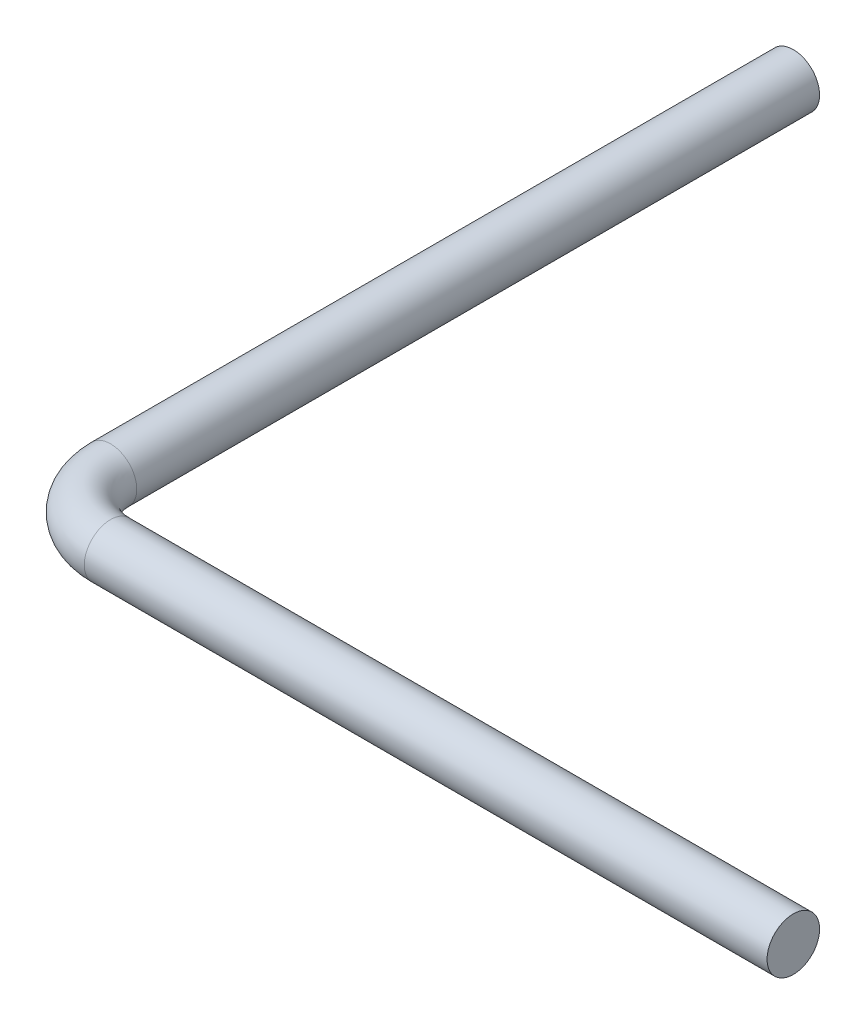
ISO-10303-21;
HEADER;
FILE_DESCRIPTION(('STEP AP214'),'2;1');
FILE_NAME('part.step','',(''),(''),'','','');
FILE_SCHEMA(('AUTOMOTIVE_DESIGN { 1 0 10303 214 1 1 1 1 }'));
ENDSEC;
DATA;
#1=APPLICATION_CONTEXT('core data for automotive mechanical design processes');
#2=APPLICATION_PROTOCOL_DEFINITION('international standard','automotive_design',2000,#1);
#3=PRODUCT_CONTEXT('',#1,'mechanical');
#4=PRODUCT('Part','Part','',(#3));
#5=PRODUCT_RELATED_PRODUCT_CATEGORY('part','',(#4));
#6=PRODUCT_DEFINITION_FORMATION('','',#4);
#7=PRODUCT_DEFINITION_CONTEXT('part definition',#1,'design');
#8=PRODUCT_DEFINITION('design','',#6,#7);
#9=PRODUCT_DEFINITION_SHAPE('','',#8);
#10=(LENGTH_UNIT() NAMED_UNIT(*) SI_UNIT(.MILLI.,.METRE.));
#11=(NAMED_UNIT(*) PLANE_ANGLE_UNIT() SI_UNIT($,.RADIAN.));
#12=(NAMED_UNIT(*) SI_UNIT($,.STERADIAN.) SOLID_ANGLE_UNIT());
#13=UNCERTAINTY_MEASURE_WITH_UNIT(LENGTH_MEASURE(1.E-05),#10,'distance_accuracy_value','');
#14=(GEOMETRIC_REPRESENTATION_CONTEXT(3) GLOBAL_UNCERTAINTY_ASSIGNED_CONTEXT((#13)) GLOBAL_UNIT_ASSIGNED_CONTEXT((#10,
#11,#12)) REPRESENTATION_CONTEXT('',''));
#15=CARTESIAN_POINT('',(0.,0.,0.));
#16=DIRECTION('',(0.,0.,1.));
#17=DIRECTION('',(1.,0.,0.));
#18=AXIS2_PLACEMENT_3D('',#15,#16,#17);
#19=CARTESIAN_POINT('',(0.,0.,50.));
#20=DIRECTION('',(0.,0.,-1.));
#21=DIRECTION('',(-1.,0.,0.));
#22=AXIS2_PLACEMENT_3D('',#19,#20,#21);
#23=CYLINDRICAL_SURFACE('',#22,2.);
#24=CARTESIAN_POINT('',(0.,0.,0.));
#25=DIRECTION('',(0.,0.,1.));
#26=DIRECTION('',(1.,0.,0.));
#27=AXIS2_PLACEMENT_3D('',#24,#25,#26);
#28=CIRCLE('',#27,2.);
#29=CARTESIAN_POINT('',(2.,0.,0.));
#30=VERTEX_POINT('',#29);
#31=EDGE_CURVE('E10',#30,#30,#28,.T.);
#32=ORIENTED_EDGE('',*,*,#31,.T.);
#33=EDGE_LOOP('',(#32));
#34=FACE_BOUND('',#33,.T.);
#35=CARTESIAN_POINT('',(0.,0.,52.));
#36=DIRECTION('',(0.,0.,1.));
#37=DIRECTION('',(1.,0.,0.));
#38=AXIS2_PLACEMENT_3D('',#35,#36,#37);
#39=CIRCLE('',#38,2.);
#40=CARTESIAN_POINT('',(-1.99999999999979,0.,52.));
#41=VERTEX_POINT('',#40);
#42=EDGE_CURVE('E48',#41,#41,#39,.T.);
#43=ORIENTED_EDGE('',*,*,#42,.F.);
#44=EDGE_LOOP('',(#43));
#45=FACE_BOUND('',#44,.T.);
#46=ADVANCED_FACE('F34',(#34,#45),#23,.T.);
#47=CARTESIAN_POINT('',(0.,0.,0.));
#48=DIRECTION('',(0.,0.,1.));
#49=DIRECTION('',(1.,0.,0.));
#50=AXIS2_PLACEMENT_3D('',#47,#48,#49);
#51=PLANE('',#50);
#52=ORIENTED_EDGE('',*,*,#31,.F.);
#53=EDGE_LOOP('',(#52));
#54=FACE_BOUND('',#53,.T.);
#55=ADVANCED_FACE('F57',(#54),#51,.F.);
#56=CARTESIAN_POINT('',(57.,0.,57.));
#57=DIRECTION('',(1.,0.,0.));
#58=DIRECTION('',(0.,0.,-1.));
#59=AXIS2_PLACEMENT_3D('',#56,#57,#58);
#60=PLANE('',#59);
#61=CARTESIAN_POINT('',(57.,0.,57.));
#62=DIRECTION('',(1.,0.,0.));
#63=DIRECTION('',(0.,0.,-1.));
#64=AXIS2_PLACEMENT_3D('',#61,#62,#63);
#65=CIRCLE('',#64,2.);
#66=CARTESIAN_POINT('',(57.,0.,55.));
#67=VERTEX_POINT('',#66);
#68=EDGE_CURVE('E40',#67,#67,#65,.T.);
#69=ORIENTED_EDGE('',*,*,#68,.T.);
#70=EDGE_LOOP('',(#69));
#71=FACE_BOUND('',#70,.T.);
#72=ADVANCED_FACE('F61',(#71),#60,.T.);
#73=CARTESIAN_POINT('',(5.,0.,52.));
#74=DIRECTION('',(0.,1.,0.));
#75=DIRECTION('',(0.,0.,1.));
#76=AXIS2_PLACEMENT_3D('',#73,#74,#75);
#77=TOROIDAL_SURFACE('',#76,4.99999999999979,2.);
#78=CARTESIAN_POINT('',(5.,0.,57.));
#79=DIRECTION('',(1.,0.,0.));
#80=DIRECTION('',(0.,0.,-1.));
#81=AXIS2_PLACEMENT_3D('',#78,#79,#80);
#82=CIRCLE('',#81,2.);
#83=CARTESIAN_POINT('',(5.00000000000001,0.,58.9999999999998));
#84=VERTEX_POINT('',#83);
#85=EDGE_CURVE('E44',#84,#84,#82,.T.);
#86=CARTESIAN_POINT('',(5.,0.,52.));
#87=DIRECTION('',(0.,1.,0.));
#88=DIRECTION('',(0.,0.,1.));
#89=AXIS2_PLACEMENT_3D('',#86,#87,#88);
#90=CIRCLE('',#89,6.99999999999979);
#91=EDGE_CURVE('',#41,#84,#90,.T.);
#92=ORIENTED_EDGE('',*,*,#42,.T.);
#93=ORIENTED_EDGE('',*,*,#85,.F.);
#94=ORIENTED_EDGE('',*,*,#91,.T.);
#95=ORIENTED_EDGE('',*,*,#91,.F.);
#96=EDGE_LOOP('',(#92,#94,#93,#95));
#97=FACE_BOUND('',#96,.T.);
#98=ADVANCED_FACE('F54',(#97),#77,.T.);
#99=CARTESIAN_POINT('',(5.,0.,57.));
#100=DIRECTION('',(1.,0.,0.));
#101=DIRECTION('',(0.,0.,-1.));
#102=AXIS2_PLACEMENT_3D('',#99,#100,#101);
#103=CYLINDRICAL_SURFACE('',#102,2.);
#104=ORIENTED_EDGE('',*,*,#68,.F.);
#105=EDGE_LOOP('',(#104));
#106=FACE_BOUND('',#105,.T.);
#107=ORIENTED_EDGE('',*,*,#85,.T.);
#108=EDGE_LOOP('',(#107));
#109=FACE_BOUND('',#108,.T.);
#110=ADVANCED_FACE('F63',(#106,#109),#103,.T.);
#111=CLOSED_SHELL('',(#46,#55,#72,#98,#110));
#112=MANIFOLD_SOLID_BREP('B2',#111);
#113=ADVANCED_BREP_SHAPE_REPRESENTATION('',(#18,#112),#14);
#114=SHAPE_DEFINITION_REPRESENTATION(#9,#113);
ENDSEC;
END-ISO-10303-21;
